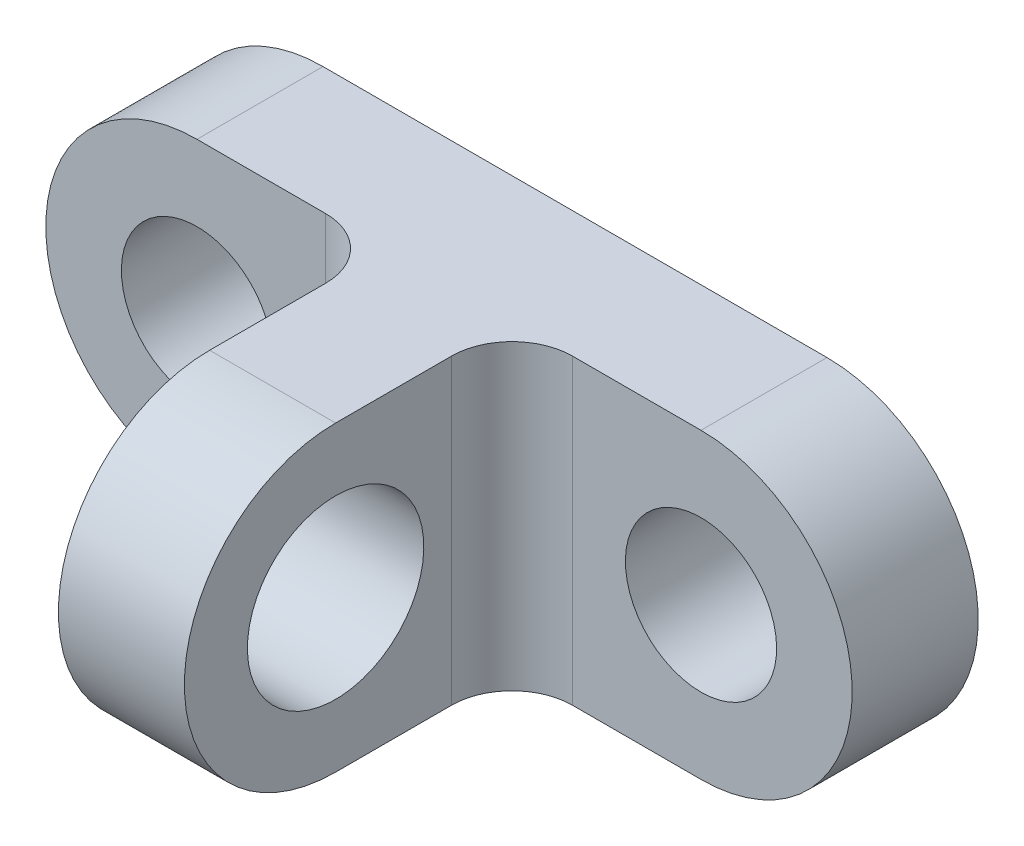
ISO-10303-21;
HEADER;
FILE_DESCRIPTION(('STEP AP214'),'2;1');
FILE_NAME('part.step','',(''),(''),'','','');
FILE_SCHEMA(('AUTOMOTIVE_DESIGN { 1 0 10303 214 1 1 1 1 }'));
ENDSEC;
DATA;
#1=APPLICATION_CONTEXT('core data for automotive mechanical design processes');
#2=APPLICATION_PROTOCOL_DEFINITION('international standard','automotive_design',2000,#1);
#3=PRODUCT_CONTEXT('',#1,'mechanical');
#4=PRODUCT('Part','Part','',(#3));
#5=PRODUCT_RELATED_PRODUCT_CATEGORY('part','',(#4));
#6=PRODUCT_DEFINITION_FORMATION('','',#4);
#7=PRODUCT_DEFINITION_CONTEXT('part definition',#1,'design');
#8=PRODUCT_DEFINITION('design','',#6,#7);
#9=PRODUCT_DEFINITION_SHAPE('','',#8);
#10=(LENGTH_UNIT() NAMED_UNIT(*) SI_UNIT(.MILLI.,.METRE.));
#11=(NAMED_UNIT(*) PLANE_ANGLE_UNIT() SI_UNIT($,.RADIAN.));
#12=(NAMED_UNIT(*) SI_UNIT($,.STERADIAN.) SOLID_ANGLE_UNIT());
#13=UNCERTAINTY_MEASURE_WITH_UNIT(LENGTH_MEASURE(1.E-05),#10,'distance_accuracy_value','');
#14=(GEOMETRIC_REPRESENTATION_CONTEXT(3) GLOBAL_UNCERTAINTY_ASSIGNED_CONTEXT((#13)) GLOBAL_UNIT_ASSIGNED_CONTEXT((#10,
#11,#12)) REPRESENTATION_CONTEXT('',''));
#15=CARTESIAN_POINT('',(0.,0.,0.));
#16=DIRECTION('',(0.,0.,1.));
#17=DIRECTION('',(1.,0.,0.));
#18=AXIS2_PLACEMENT_3D('',#15,#16,#17);
#19=CARTESIAN_POINT('',(-50.,0.,25.));
#20=DIRECTION('',(0.,0.,1.));
#21=DIRECTION('',(1.,0.,0.));
#22=AXIS2_PLACEMENT_3D('',#19,#20,#21);
#23=PLANE('',#22);
#24=CARTESIAN_POINT('',(50.,0.,25.));
#25=DIRECTION('',(0.,0.,-1.));
#26=DIRECTION('',(0.,-1.,0.));
#27=AXIS2_PLACEMENT_3D('',#24,#25,#26);
#28=CIRCLE('',#27,15.);
#29=CARTESIAN_POINT('',(50.,-15.,25.));
#30=VERTEX_POINT('',#29);
#31=EDGE_CURVE('E241',#30,#30,#28,.T.);
#32=ORIENTED_EDGE('',*,*,#31,.T.);
#33=EDGE_LOOP('',(#32));
#34=FACE_BOUND('',#33,.T.);
#35=DIRECTION('',(-1.,0.,0.));
#36=VECTOR('',#35,1.);
#37=CARTESIAN_POINT('',(50.,30.,25.));
#38=LINE('',#37,#36);
#39=CARTESIAN_POINT('',(50.,30.,25.));
#40=VERTEX_POINT('',#39);
#41=CARTESIAN_POINT('',(24.5,30.,25.));
#42=VERTEX_POINT('',#41);
#43=EDGE_CURVE('E148',#40,#42,#38,.T.);
#44=ORIENTED_EDGE('',*,*,#43,.T.);
#45=DIRECTION('',(0.,-1.,0.));
#46=VECTOR('',#45,1.);
#47=CARTESIAN_POINT('',(24.5,0.,25.));
#48=LINE('',#47,#46);
#49=CARTESIAN_POINT('',(24.5,-30.,25.));
#50=VERTEX_POINT('',#49);
#51=EDGE_CURVE('E180',#42,#50,#48,.T.);
#52=ORIENTED_EDGE('',*,*,#51,.T.);
#53=DIRECTION('',(1.,0.,0.));
#54=VECTOR('',#53,1.);
#55=CARTESIAN_POINT('',(-50.,-30.,25.));
#56=LINE('',#55,#54);
#57=CARTESIAN_POINT('',(50.,-30.,25.));
#58=VERTEX_POINT('',#57);
#59=EDGE_CURVE('E138',#50,#58,#56,.T.);
#60=ORIENTED_EDGE('',*,*,#59,.T.);
#61=CARTESIAN_POINT('',(50.,0.,25.));
#62=DIRECTION('',(0.,0.,1.));
#63=DIRECTION('',(-1.,0.,0.));
#64=AXIS2_PLACEMENT_3D('',#61,#62,#63);
#65=CIRCLE('',#64,30.);
#66=EDGE_CURVE('E134',#58,#40,#65,.T.);
#67=ORIENTED_EDGE('',*,*,#66,.T.);
#68=EDGE_LOOP('',(#44,#52,#60,#67));
#69=FACE_BOUND('',#68,.T.);
#70=ADVANCED_FACE('F16',(#34,#69),#23,.T.);
#71=CARTESIAN_POINT('',(-50.,0.,25.));
#72=DIRECTION('',(0.,0.,-1.));
#73=DIRECTION('',(-1.,0.,0.));
#74=AXIS2_PLACEMENT_3D('',#71,#72,#73);
#75=CYLINDRICAL_SURFACE('',#74,30.);
#76=CARTESIAN_POINT('',(-50.,0.,0.));
#77=DIRECTION('',(0.,0.,1.));
#78=DIRECTION('',(1.,0.,0.));
#79=AXIS2_PLACEMENT_3D('',#76,#77,#78);
#80=CIRCLE('',#79,30.);
#81=CARTESIAN_POINT('',(-50.,30.,0.));
#82=VERTEX_POINT('',#81);
#83=CARTESIAN_POINT('',(-50.,-30.,0.));
#84=VERTEX_POINT('',#83);
#85=EDGE_CURVE('E112',#82,#84,#80,.T.);
#86=ORIENTED_EDGE('',*,*,#85,.T.);
#87=DIRECTION('',(0.,0.,-1.));
#88=VECTOR('',#87,1.);
#89=CARTESIAN_POINT('',(-50.,-30.,25.));
#90=LINE('',#89,#88);
#91=CARTESIAN_POINT('',(-50.,-30.,25.));
#92=VERTEX_POINT('',#91);
#93=EDGE_CURVE('E146',#92,#84,#90,.T.);
#94=ORIENTED_EDGE('',*,*,#93,.F.);
#95=CARTESIAN_POINT('',(-50.,0.,25.));
#96=DIRECTION('',(0.,0.,1.));
#97=DIRECTION('',(1.,0.,0.));
#98=AXIS2_PLACEMENT_3D('',#95,#96,#97);
#99=CIRCLE('',#98,30.);
#100=CARTESIAN_POINT('',(-50.,30.,25.));
#101=VERTEX_POINT('',#100);
#102=EDGE_CURVE('E157',#101,#92,#99,.T.);
#103=ORIENTED_EDGE('',*,*,#102,.F.);
#104=DIRECTION('',(0.,0.,-1.));
#105=VECTOR('',#104,1.);
#106=CARTESIAN_POINT('',(-50.,30.,25.));
#107=LINE('',#106,#105);
#108=EDGE_CURVE('E152',#101,#82,#107,.T.);
#109=ORIENTED_EDGE('',*,*,#108,.T.);
#110=EDGE_LOOP('',(#86,#94,#103,#109));
#111=FACE_BOUND('',#110,.T.);
#112=ADVANCED_FACE('F270',(#111),#75,.T.);
#113=CARTESIAN_POINT('',(-50.,-30.,25.));
#114=DIRECTION('',(0.,1.,0.));
#115=DIRECTION('',(-1.,0.,0.));
#116=AXIS2_PLACEMENT_3D('',#113,#114,#115);
#117=PLANE('',#116);
#118=DIRECTION('',(1.,0.,0.));
#119=VECTOR('',#118,1.);
#120=CARTESIAN_POINT('',(-50.,-30.,0.));
#121=LINE('',#120,#119);
#122=CARTESIAN_POINT('',(50.,-30.,0.));
#123=VERTEX_POINT('',#122);
#124=EDGE_CURVE('E209',#84,#123,#121,.T.);
#125=ORIENTED_EDGE('',*,*,#124,.T.);
#126=DIRECTION('',(0.,0.,-1.));
#127=VECTOR('',#126,1.);
#128=CARTESIAN_POINT('',(50.,-30.,25.));
#129=LINE('',#128,#127);
#130=EDGE_CURVE('E186',#58,#123,#129,.T.);
#131=ORIENTED_EDGE('',*,*,#130,.F.);
#132=ORIENTED_EDGE('',*,*,#59,.F.);
#133=CARTESIAN_POINT('',(24.5,-30.,37.));
#134=DIRECTION('',(0.,1.,0.));
#135=DIRECTION('',(-1.,0.,0.));
#136=AXIS2_PLACEMENT_3D('',#133,#134,#135);
#137=CIRCLE('',#136,12.);
#138=CARTESIAN_POINT('',(12.5,-30.,37.));
#139=VERTEX_POINT('',#138);
#140=EDGE_CURVE('E97',#50,#139,#137,.T.);
#141=ORIENTED_EDGE('',*,*,#140,.T.);
#142=DIRECTION('',(0.,0.,1.));
#143=VECTOR('',#142,1.);
#144=CARTESIAN_POINT('',(12.5,-30.,25.));
#145=LINE('',#144,#143);
#146=CARTESIAN_POINT('',(12.5,-30.,60.));
#147=VERTEX_POINT('',#146);
#148=EDGE_CURVE('E91',#139,#147,#145,.T.);
#149=ORIENTED_EDGE('',*,*,#148,.T.);
#150=DIRECTION('',(-1.,0.,0.));
#151=VECTOR('',#150,1.);
#152=CARTESIAN_POINT('',(12.5,-30.,60.));
#153=LINE('',#152,#151);
#154=CARTESIAN_POINT('',(-12.5,-30.,60.));
#155=VERTEX_POINT('',#154);
#156=EDGE_CURVE('E94',#147,#155,#153,.T.);
#157=ORIENTED_EDGE('',*,*,#156,.T.);
#158=DIRECTION('',(0.,0.,1.));
#159=VECTOR('',#158,1.);
#160=CARTESIAN_POINT('',(-12.5,-30.,25.));
#161=LINE('',#160,#159);
#162=CARTESIAN_POINT('',(-12.5,-30.,37.));
#163=VERTEX_POINT('',#162);
#164=EDGE_CURVE('E129',#163,#155,#161,.T.);
#165=ORIENTED_EDGE('',*,*,#164,.F.);
#166=CARTESIAN_POINT('',(-24.5,-30.,37.));
#167=DIRECTION('',(0.,1.,0.));
#168=DIRECTION('',(-1.,0.,0.));
#169=AXIS2_PLACEMENT_3D('',#166,#167,#168);
#170=CIRCLE('',#169,12.);
#171=CARTESIAN_POINT('',(-24.5,-30.,25.));
#172=VERTEX_POINT('',#171);
#173=EDGE_CURVE('E25',#163,#172,#170,.T.);
#174=ORIENTED_EDGE('',*,*,#173,.T.);
#175=EDGE_CURVE('E142',#92,#172,#56,.T.);
#176=ORIENTED_EDGE('',*,*,#175,.F.);
#177=ORIENTED_EDGE('',*,*,#93,.T.);
#178=EDGE_LOOP('',(#125,#131,#132,#141,#149,#157,#165,#174,#176,#177));
#179=FACE_BOUND('',#178,.T.);
#180=ADVANCED_FACE('F93',(#179),#117,.F.);
#181=CARTESIAN_POINT('',(50.,0.,25.));
#182=DIRECTION('',(0.,0.,-1.));
#183=DIRECTION('',(-1.,0.,0.));
#184=AXIS2_PLACEMENT_3D('',#181,#182,#183);
#185=CYLINDRICAL_SURFACE('',#184,30.);
#186=CARTESIAN_POINT('',(50.,0.,0.));
#187=DIRECTION('',(0.,0.,1.));
#188=DIRECTION('',(-1.,0.,0.));
#189=AXIS2_PLACEMENT_3D('',#186,#187,#188);
#190=CIRCLE('',#189,30.);
#191=CARTESIAN_POINT('',(50.,30.,0.));
#192=VERTEX_POINT('',#191);
#193=EDGE_CURVE('E203',#123,#192,#190,.T.);
#194=ORIENTED_EDGE('',*,*,#193,.T.);
#195=DIRECTION('',(0.,0.,-1.));
#196=VECTOR('',#195,1.);
#197=CARTESIAN_POINT('',(50.,30.,25.));
#198=LINE('',#197,#196);
#199=EDGE_CURVE('E189',#40,#192,#198,.T.);
#200=ORIENTED_EDGE('',*,*,#199,.F.);
#201=ORIENTED_EDGE('',*,*,#66,.F.);
#202=ORIENTED_EDGE('',*,*,#130,.T.);
#203=EDGE_LOOP('',(#194,#200,#201,#202));
#204=FACE_BOUND('',#203,.T.);
#205=ADVANCED_FACE('F291',(#204),#185,.T.);
#206=CARTESIAN_POINT('',(50.,30.,25.));
#207=DIRECTION('',(0.,-1.,0.));
#208=DIRECTION('',(1.,0.,0.));
#209=AXIS2_PLACEMENT_3D('',#206,#207,#208);
#210=PLANE('',#209);
#211=DIRECTION('',(-1.,0.,0.));
#212=VECTOR('',#211,1.);
#213=CARTESIAN_POINT('',(50.,30.,0.));
#214=LINE('',#213,#212);
#215=EDGE_CURVE('E200',#192,#82,#214,.T.);
#216=ORIENTED_EDGE('',*,*,#215,.T.);
#217=ORIENTED_EDGE('',*,*,#108,.F.);
#218=CARTESIAN_POINT('',(-24.5,30.,25.));
#219=VERTEX_POINT('',#218);
#220=EDGE_CURVE('E153',#219,#101,#38,.T.);
#221=ORIENTED_EDGE('',*,*,#220,.F.);
#222=CARTESIAN_POINT('',(-24.5,30.,37.));
#223=DIRECTION('',(0.,-1.,0.));
#224=DIRECTION('',(1.,0.,0.));
#225=AXIS2_PLACEMENT_3D('',#222,#223,#224);
#226=CIRCLE('',#225,12.);
#227=CARTESIAN_POINT('',(-12.5,30.,37.));
#228=VERTEX_POINT('',#227);
#229=EDGE_CURVE('E9',#219,#228,#226,.T.);
#230=ORIENTED_EDGE('',*,*,#229,.T.);
#231=DIRECTION('',(0.,0.,-1.));
#232=VECTOR('',#231,1.);
#233=CARTESIAN_POINT('',(-12.5,30.,60.));
#234=LINE('',#233,#232);
#235=CARTESIAN_POINT('',(-12.5,30.,60.));
#236=VERTEX_POINT('',#235);
#237=EDGE_CURVE('E103',#236,#228,#234,.T.);
#238=ORIENTED_EDGE('',*,*,#237,.F.);
#239=DIRECTION('',(-1.,0.,0.));
#240=VECTOR('',#239,1.);
#241=CARTESIAN_POINT('',(12.5,30.,60.));
#242=LINE('',#241,#240);
#243=CARTESIAN_POINT('',(12.5,30.,60.));
#244=VERTEX_POINT('',#243);
#245=EDGE_CURVE('E113',#244,#236,#242,.T.);
#246=ORIENTED_EDGE('',*,*,#245,.F.);
#247=DIRECTION('',(0.,0.,-1.));
#248=VECTOR('',#247,1.);
#249=CARTESIAN_POINT('',(12.5,30.,60.));
#250=LINE('',#249,#248);
#251=CARTESIAN_POINT('',(12.5,30.,37.));
#252=VERTEX_POINT('',#251);
#253=EDGE_CURVE('E117',#244,#252,#250,.T.);
#254=ORIENTED_EDGE('',*,*,#253,.T.);
#255=CARTESIAN_POINT('',(24.5,30.,37.));
#256=DIRECTION('',(0.,-1.,0.));
#257=DIRECTION('',(1.,0.,0.));
#258=AXIS2_PLACEMENT_3D('',#255,#256,#257);
#259=CIRCLE('',#258,12.);
#260=EDGE_CURVE('E173',#252,#42,#259,.T.);
#261=ORIENTED_EDGE('',*,*,#260,.T.);
#262=ORIENTED_EDGE('',*,*,#43,.F.);
#263=ORIENTED_EDGE('',*,*,#199,.T.);
#264=EDGE_LOOP('',(#216,#217,#221,#230,#238,#246,#254,#261,#262,#263));
#265=FACE_BOUND('',#264,.T.);
#266=ADVANCED_FACE('F284',(#265),#210,.F.);
#267=CARTESIAN_POINT('',(-50.,0.,25.));
#268=DIRECTION('',(0.,0.,-1.));
#269=DIRECTION('',(0.,-1.,0.));
#270=AXIS2_PLACEMENT_3D('',#267,#268,#269);
#271=CIRCLE('',#270,15.);
#272=CARTESIAN_POINT('',(-50.,-15.,25.));
#273=VERTEX_POINT('',#272);
#274=EDGE_CURVE('E125',#273,#273,#271,.T.);
#275=ORIENTED_EDGE('',*,*,#274,.T.);
#276=EDGE_LOOP('',(#275));
#277=FACE_BOUND('',#276,.T.);
#278=ORIENTED_EDGE('',*,*,#175,.T.);
#279=DIRECTION('',(0.,-1.,0.));
#280=VECTOR('',#279,1.);
#281=CARTESIAN_POINT('',(-24.5,30.,25.));
#282=LINE('',#281,#280);
#283=EDGE_CURVE('E38',#172,#219,#282,.F.);
#284=ORIENTED_EDGE('',*,*,#283,.T.);
#285=ORIENTED_EDGE('',*,*,#220,.T.);
#286=ORIENTED_EDGE('',*,*,#102,.T.);
#287=EDGE_LOOP('',(#278,#284,#285,#286));
#288=FACE_BOUND('',#287,.T.);
#289=ADVANCED_FACE('F273',(#277,#288),#23,.T.);
#290=CARTESIAN_POINT('',(-50.,0.,0.));
#291=DIRECTION('',(0.,0.,1.));
#292=DIRECTION('',(1.,0.,0.));
#293=AXIS2_PLACEMENT_3D('',#290,#291,#292);
#294=PLANE('',#293);
#295=CARTESIAN_POINT('',(50.,0.,0.));
#296=DIRECTION('',(0.,0.,1.));
#297=DIRECTION('',(1.,0.,0.));
#298=AXIS2_PLACEMENT_3D('',#295,#296,#297);
#299=CIRCLE('',#298,15.);
#300=CARTESIAN_POINT('',(65.,0.,0.));
#301=VERTEX_POINT('',#300);
#302=EDGE_CURVE('E238',#301,#301,#299,.T.);
#303=ORIENTED_EDGE('',*,*,#302,.T.);
#304=EDGE_LOOP('',(#303));
#305=FACE_BOUND('',#304,.T.);
#306=CARTESIAN_POINT('',(-50.,0.,0.));
#307=DIRECTION('',(0.,0.,1.));
#308=DIRECTION('',(1.,0.,0.));
#309=AXIS2_PLACEMENT_3D('',#306,#307,#308);
#310=CIRCLE('',#309,15.);
#311=CARTESIAN_POINT('',(-35.,0.,0.));
#312=VERTEX_POINT('',#311);
#313=EDGE_CURVE('E231',#312,#312,#310,.T.);
#314=ORIENTED_EDGE('',*,*,#313,.T.);
#315=EDGE_LOOP('',(#314));
#316=FACE_BOUND('',#315,.T.);
#317=ORIENTED_EDGE('',*,*,#85,.F.);
#318=ORIENTED_EDGE('',*,*,#215,.F.);
#319=ORIENTED_EDGE('',*,*,#193,.F.);
#320=ORIENTED_EDGE('',*,*,#124,.F.);
#321=EDGE_LOOP('',(#317,#318,#319,#320));
#322=FACE_BOUND('',#321,.T.);
#323=ADVANCED_FACE('F283',(#305,#316,#322),#294,.F.);
#324=CARTESIAN_POINT('',(12.5,0.,60.));
#325=DIRECTION('',(-1.,0.,0.));
#326=DIRECTION('',(0.,0.,1.));
#327=AXIS2_PLACEMENT_3D('',#324,#325,#326);
#328=CYLINDRICAL_SURFACE('',#327,30.);
#329=CARTESIAN_POINT('',(-12.5,0.,60.));
#330=DIRECTION('',(-1.,0.,0.));
#331=DIRECTION('',(0.,-1.,0.));
#332=AXIS2_PLACEMENT_3D('',#329,#330,#331);
#333=CIRCLE('',#332,30.);
#334=EDGE_CURVE('E110',#155,#236,#333,.T.);
#335=ORIENTED_EDGE('',*,*,#334,.F.);
#336=ORIENTED_EDGE('',*,*,#156,.F.);
#337=CARTESIAN_POINT('',(12.5,0.,60.));
#338=DIRECTION('',(-1.,0.,0.));
#339=DIRECTION('',(0.,-1.,0.));
#340=AXIS2_PLACEMENT_3D('',#337,#338,#339);
#341=CIRCLE('',#340,30.);
#342=EDGE_CURVE('E102',#147,#244,#341,.T.);
#343=ORIENTED_EDGE('',*,*,#342,.T.);
#344=ORIENTED_EDGE('',*,*,#245,.T.);
#345=EDGE_LOOP('',(#335,#336,#343,#344));
#346=FACE_BOUND('',#345,.T.);
#347=ADVANCED_FACE('F107',(#346),#328,.T.);
#348=CARTESIAN_POINT('',(12.5,0.,60.));
#349=DIRECTION('',(-1.,0.,0.));
#350=DIRECTION('',(0.,-1.,0.));
#351=AXIS2_PLACEMENT_3D('',#348,#349,#350);
#352=PLANE('',#351);
#353=CARTESIAN_POINT('',(12.5,0.,60.));
#354=DIRECTION('',(-1.,0.,0.));
#355=DIRECTION('',(0.,1.,0.));
#356=AXIS2_PLACEMENT_3D('',#353,#354,#355);
#357=CIRCLE('',#356,17.5);
#358=CARTESIAN_POINT('',(12.5,17.5,60.));
#359=VERTEX_POINT('',#358);
#360=EDGE_CURVE('E248',#359,#359,#357,.T.);
#361=ORIENTED_EDGE('',*,*,#360,.T.);
#362=EDGE_LOOP('',(#361));
#363=FACE_BOUND('',#362,.T.);
#364=ORIENTED_EDGE('',*,*,#148,.F.);
#365=DIRECTION('',(0.,-1.,0.));
#366=VECTOR('',#365,1.);
#367=CARTESIAN_POINT('',(12.5,0.,37.));
#368=LINE('',#367,#366);
#369=EDGE_CURVE('E177',#139,#252,#368,.F.);
#370=ORIENTED_EDGE('',*,*,#369,.T.);
#371=ORIENTED_EDGE('',*,*,#253,.F.);
#372=ORIENTED_EDGE('',*,*,#342,.F.);
#373=EDGE_LOOP('',(#364,#370,#371,#372));
#374=FACE_BOUND('',#373,.T.);
#375=ADVANCED_FACE('F115',(#363,#374),#352,.F.);
#376=CARTESIAN_POINT('',(-12.5,0.,60.));
#377=DIRECTION('',(-1.,0.,0.));
#378=DIRECTION('',(0.,-1.,0.));
#379=AXIS2_PLACEMENT_3D('',#376,#377,#378);
#380=PLANE('',#379);
#381=CARTESIAN_POINT('',(-12.5,0.,60.));
#382=DIRECTION('',(-1.,0.,0.));
#383=DIRECTION('',(0.,-1.,0.));
#384=AXIS2_PLACEMENT_3D('',#381,#382,#383);
#385=CIRCLE('',#384,17.5);
#386=CARTESIAN_POINT('',(-12.5,-17.5,60.));
#387=VERTEX_POINT('',#386);
#388=EDGE_CURVE('E245',#387,#387,#385,.T.);
#389=ORIENTED_EDGE('',*,*,#388,.F.);
#390=EDGE_LOOP('',(#389));
#391=FACE_BOUND('',#390,.T.);
#392=ORIENTED_EDGE('',*,*,#237,.T.);
#393=DIRECTION('',(0.,-1.,0.));
#394=VECTOR('',#393,1.);
#395=CARTESIAN_POINT('',(-12.5,-30.,37.));
#396=LINE('',#395,#394);
#397=EDGE_CURVE('E164',#228,#163,#396,.T.);
#398=ORIENTED_EDGE('',*,*,#397,.T.);
#399=ORIENTED_EDGE('',*,*,#164,.T.);
#400=ORIENTED_EDGE('',*,*,#334,.T.);
#401=EDGE_LOOP('',(#392,#398,#399,#400));
#402=FACE_BOUND('',#401,.T.);
#403=ADVANCED_FACE('F303',(#391,#402),#380,.T.);
#404=CARTESIAN_POINT('',(-50.,0.,25.));
#405=DIRECTION('',(0.,0.,-1.));
#406=DIRECTION('',(0.,-1.,0.));
#407=AXIS2_PLACEMENT_3D('',#404,#405,#406);
#408=CYLINDRICAL_SURFACE('',#407,15.);
#409=ORIENTED_EDGE('',*,*,#274,.F.);
#410=EDGE_LOOP('',(#409));
#411=FACE_BOUND('',#410,.T.);
#412=ORIENTED_EDGE('',*,*,#313,.F.);
#413=EDGE_LOOP('',(#412));
#414=FACE_BOUND('',#413,.T.);
#415=ADVANCED_FACE('F266',(#411,#414),#408,.F.);
#416=CARTESIAN_POINT('',(50.,0.,25.));
#417=DIRECTION('',(0.,0.,-1.));
#418=DIRECTION('',(0.,-1.,0.));
#419=AXIS2_PLACEMENT_3D('',#416,#417,#418);
#420=CYLINDRICAL_SURFACE('',#419,15.);
#421=ORIENTED_EDGE('',*,*,#31,.F.);
#422=EDGE_LOOP('',(#421));
#423=FACE_BOUND('',#422,.T.);
#424=ORIENTED_EDGE('',*,*,#302,.F.);
#425=EDGE_LOOP('',(#424));
#426=FACE_BOUND('',#425,.T.);
#427=ADVANCED_FACE('F257',(#423,#426),#420,.F.);
#428=CARTESIAN_POINT('',(12.5,0.,60.));
#429=DIRECTION('',(-1.,0.,0.));
#430=DIRECTION('',(0.,1.,0.));
#431=AXIS2_PLACEMENT_3D('',#428,#429,#430);
#432=CYLINDRICAL_SURFACE('',#431,17.5);
#433=ORIENTED_EDGE('',*,*,#388,.T.);
#434=EDGE_LOOP('',(#433));
#435=FACE_BOUND('',#434,.T.);
#436=ORIENTED_EDGE('',*,*,#360,.F.);
#437=EDGE_LOOP('',(#436));
#438=FACE_BOUND('',#437,.T.);
#439=ADVANCED_FACE('F254',(#435,#438),#432,.F.);
#440=CARTESIAN_POINT('',(24.5,0.,37.));
#441=DIRECTION('',(0.,-1.,0.));
#442=DIRECTION('',(1.,0.,0.));
#443=AXIS2_PLACEMENT_3D('',#440,#441,#442);
#444=CYLINDRICAL_SURFACE('',#443,12.);
#445=ORIENTED_EDGE('',*,*,#260,.F.);
#446=ORIENTED_EDGE('',*,*,#369,.F.);
#447=ORIENTED_EDGE('',*,*,#140,.F.);
#448=ORIENTED_EDGE('',*,*,#51,.F.);
#449=EDGE_LOOP('',(#445,#446,#447,#448));
#450=FACE_BOUND('',#449,.T.);
#451=ADVANCED_FACE('F256',(#450),#444,.F.);
#452=CARTESIAN_POINT('',(-24.5,0.,37.));
#453=DIRECTION('',(0.,1.,0.));
#454=DIRECTION('',(-1.,0.,0.));
#455=AXIS2_PLACEMENT_3D('',#452,#453,#454);
#456=CYLINDRICAL_SURFACE('',#455,12.);
#457=ORIENTED_EDGE('',*,*,#229,.F.);
#458=ORIENTED_EDGE('',*,*,#283,.F.);
#459=ORIENTED_EDGE('',*,*,#173,.F.);
#460=ORIENTED_EDGE('',*,*,#397,.F.);
#461=EDGE_LOOP('',(#457,#458,#459,#460));
#462=FACE_BOUND('',#461,.T.);
#463=ADVANCED_FACE('F18',(#462),#456,.F.);
#464=CLOSED_SHELL('',(#70,#112,#180,#205,#266,#289,#323,#347,#375,#403,#415,#427,#439,#451,#463));
#465=MANIFOLD_SOLID_BREP('B1',#464);
#466=ADVANCED_BREP_SHAPE_REPRESENTATION('',(#18,#465),#14);
#467=SHAPE_DEFINITION_REPRESENTATION(#9,#466);
ENDSEC;
END-ISO-10303-21;
